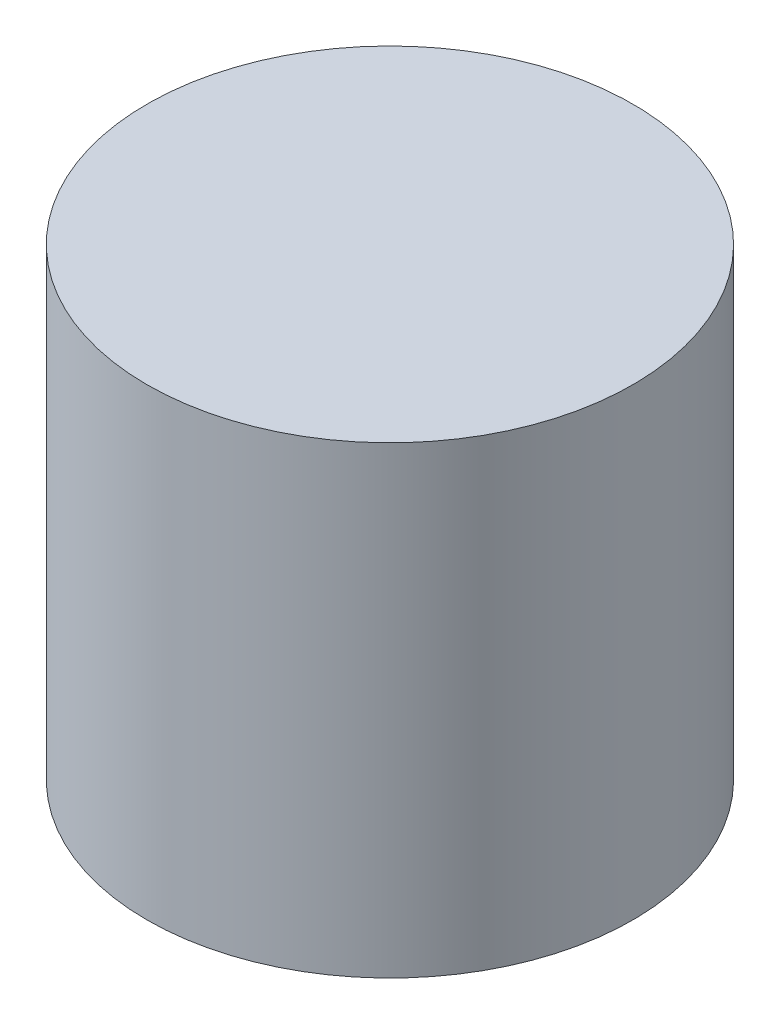
ISO-10303-21;
HEADER;
FILE_DESCRIPTION(('STEP AP214'),'2;1');
FILE_NAME('part.step','',(''),(''),'','','');
FILE_SCHEMA(('AUTOMOTIVE_DESIGN { 1 0 10303 214 1 1 1 1 }'));
ENDSEC;
DATA;
#1=APPLICATION_CONTEXT('core data for automotive mechanical design processes');
#2=APPLICATION_PROTOCOL_DEFINITION('international standard','automotive_design',2000,#1);
#3=PRODUCT_CONTEXT('',#1,'mechanical');
#4=PRODUCT('Part','Part','',(#3));
#5=PRODUCT_RELATED_PRODUCT_CATEGORY('part','',(#4));
#6=PRODUCT_DEFINITION_FORMATION('','',#4);
#7=PRODUCT_DEFINITION_CONTEXT('part definition',#1,'design');
#8=PRODUCT_DEFINITION('design','',#6,#7);
#9=PRODUCT_DEFINITION_SHAPE('','',#8);
#10=(LENGTH_UNIT() NAMED_UNIT(*) SI_UNIT(.MILLI.,.METRE.));
#11=(NAMED_UNIT(*) PLANE_ANGLE_UNIT() SI_UNIT($,.RADIAN.));
#12=(NAMED_UNIT(*) SI_UNIT($,.STERADIAN.) SOLID_ANGLE_UNIT());
#13=UNCERTAINTY_MEASURE_WITH_UNIT(LENGTH_MEASURE(1.E-05),#10,'distance_accuracy_value','');
#14=(GEOMETRIC_REPRESENTATION_CONTEXT(3) GLOBAL_UNCERTAINTY_ASSIGNED_CONTEXT((#13)) GLOBAL_UNIT_ASSIGNED_CONTEXT((#10,
#11,#12)) REPRESENTATION_CONTEXT('',''));
#15=CARTESIAN_POINT('',(0.,0.,0.));
#16=DIRECTION('',(0.,0.,1.));
#17=DIRECTION('',(1.,0.,0.));
#18=AXIS2_PLACEMENT_3D('',#15,#16,#17);
#19=CARTESIAN_POINT('',(0.,45.,0.));
#20=DIRECTION('',(0.,1.,0.));
#21=DIRECTION('',(0.,0.,1.));
#22=AXIS2_PLACEMENT_3D('',#19,#20,#21);
#23=PLANE('',#22);
#24=CARTESIAN_POINT('',(0.,45.,0.));
#25=DIRECTION('',(0.,1.,0.));
#26=DIRECTION('',(0.,0.,1.));
#27=AXIS2_PLACEMENT_3D('',#24,#25,#26);
#28=CIRCLE('',#27,260.);
#29=CARTESIAN_POINT('',(0.,45.,260.));
#30=VERTEX_POINT('',#29);
#31=EDGE_CURVE('E10',#30,#30,#28,.T.);
#32=ORIENTED_EDGE('',*,*,#31,.T.);
#33=EDGE_LOOP('',(#32));
#34=FACE_BOUND('',#33,.T.);
#35=ADVANCED_FACE('F37',(#34),#23,.T.);
#36=CARTESIAN_POINT('',(0.,45.,0.));
#37=DIRECTION('',(0.,1.,0.));
#38=DIRECTION('',(0.,0.,1.));
#39=AXIS2_PLACEMENT_3D('',#36,#37,#38);
#40=CYLINDRICAL_SURFACE('',#39,260.);
#41=CARTESIAN_POINT('',(0.,-451.,0.));
#42=DIRECTION('',(0.,1.,0.));
#43=DIRECTION('',(0.,0.,1.));
#44=AXIS2_PLACEMENT_3D('',#41,#42,#43);
#45=CIRCLE('',#44,260.);
#46=CARTESIAN_POINT('',(0.,-451.,260.));
#47=VERTEX_POINT('',#46);
#48=EDGE_CURVE('E44',#47,#47,#45,.T.);
#49=ORIENTED_EDGE('',*,*,#48,.T.);
#50=EDGE_LOOP('',(#49));
#51=FACE_BOUND('',#50,.T.);
#52=ORIENTED_EDGE('',*,*,#31,.F.);
#53=EDGE_LOOP('',(#52));
#54=FACE_BOUND('',#53,.T.);
#55=ADVANCED_FACE('F73',(#51,#54),#40,.T.);
#56=CARTESIAN_POINT('',(0.,-451.,260.));
#57=DIRECTION('',(0.,-1.,0.));
#58=DIRECTION('',(0.,0.,-1.));
#59=AXIS2_PLACEMENT_3D('',#56,#57,#58);
#60=PLANE('',#59);
#61=CARTESIAN_POINT('',(0.,-451.,0.));
#62=DIRECTION('',(0.,1.,0.));
#63=DIRECTION('',(0.,0.,1.));
#64=AXIS2_PLACEMENT_3D('',#61,#62,#63);
#65=CIRCLE('',#64,56.);
#66=CARTESIAN_POINT('',(0.,-451.,55.9999999999999));
#67=VERTEX_POINT('',#66);
#68=EDGE_CURVE('E49',#67,#67,#65,.T.);
#69=ORIENTED_EDGE('',*,*,#68,.T.);
#70=EDGE_LOOP('',(#69));
#71=FACE_BOUND('',#70,.T.);
#72=ORIENTED_EDGE('',*,*,#48,.F.);
#73=EDGE_LOOP('',(#72));
#74=FACE_BOUND('',#73,.T.);
#75=ADVANCED_FACE('F70',(#71,#74),#60,.T.);
#76=CARTESIAN_POINT('',(0.,45.,0.));
#77=DIRECTION('',(0.,1.,0.));
#78=DIRECTION('',(0.,0.,1.));
#79=AXIS2_PLACEMENT_3D('',#76,#77,#78);
#80=CYLINDRICAL_SURFACE('',#79,56.);
#81=CARTESIAN_POINT('',(0.,-551.,-1.11022302462516E-13));
#82=DIRECTION('',(0.,1.,0.));
#83=DIRECTION('',(0.,0.,1.));
#84=AXIS2_PLACEMENT_3D('',#81,#82,#83);
#85=CIRCLE('',#84,56.);
#86=CARTESIAN_POINT('',(0.,-551.,55.9999999999999));
#87=VERTEX_POINT('',#86);
#88=EDGE_CURVE('E54',#87,#87,#85,.T.);
#89=ORIENTED_EDGE('',*,*,#88,.T.);
#90=EDGE_LOOP('',(#89));
#91=FACE_BOUND('',#90,.T.);
#92=ORIENTED_EDGE('',*,*,#68,.F.);
#93=EDGE_LOOP('',(#92));
#94=FACE_BOUND('',#93,.T.);
#95=ADVANCED_FACE('F61',(#91,#94),#80,.T.);
#96=CARTESIAN_POINT('',(0.,-551.,55.9999999999999));
#97=DIRECTION('',(0.,-1.,0.));
#98=DIRECTION('',(0.,0.,-1.));
#99=AXIS2_PLACEMENT_3D('',#96,#97,#98);
#100=PLANE('',#99);
#101=ORIENTED_EDGE('',*,*,#88,.F.);
#102=EDGE_LOOP('',(#101));
#103=FACE_BOUND('',#102,.T.);
#104=ADVANCED_FACE('F64',(#103),#100,.T.);
#105=CLOSED_SHELL('',(#35,#55,#75,#95,#104));
#106=MANIFOLD_SOLID_BREP('B2',#105);
#107=ADVANCED_BREP_SHAPE_REPRESENTATION('',(#18,#106),#14);
#108=SHAPE_DEFINITION_REPRESENTATION(#9,#107);
ENDSEC;
END-ISO-10303-21;
